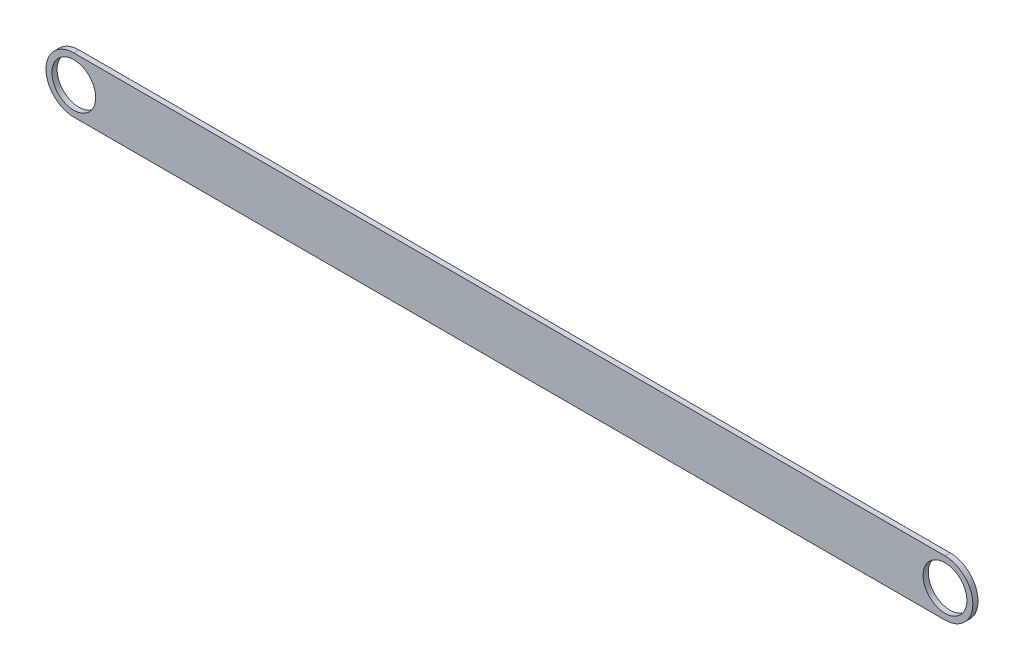
ISO-10303-21;
HEADER;
FILE_DESCRIPTION(('STEP AP214'),'2;1');
FILE_NAME('part.step','',(''),(''),'','','');
FILE_SCHEMA(('AUTOMOTIVE_DESIGN { 1 0 10303 214 1 1 1 1 }'));
ENDSEC;
DATA;
#1=APPLICATION_CONTEXT('core data for automotive mechanical design processes');
#2=APPLICATION_PROTOCOL_DEFINITION('international standard','automotive_design',2000,#1);
#3=PRODUCT_CONTEXT('',#1,'mechanical');
#4=PRODUCT('Part','Part','',(#3));
#5=PRODUCT_RELATED_PRODUCT_CATEGORY('part','',(#4));
#6=PRODUCT_DEFINITION_FORMATION('','',#4);
#7=PRODUCT_DEFINITION_CONTEXT('part definition',#1,'design');
#8=PRODUCT_DEFINITION('design','',#6,#7);
#9=PRODUCT_DEFINITION_SHAPE('','',#8);
#10=(LENGTH_UNIT() NAMED_UNIT(*) SI_UNIT(.MILLI.,.METRE.));
#11=(NAMED_UNIT(*) PLANE_ANGLE_UNIT() SI_UNIT($,.RADIAN.));
#12=(NAMED_UNIT(*) SI_UNIT($,.STERADIAN.) SOLID_ANGLE_UNIT());
#13=UNCERTAINTY_MEASURE_WITH_UNIT(LENGTH_MEASURE(1.E-05),#10,'distance_accuracy_value','');
#14=(GEOMETRIC_REPRESENTATION_CONTEXT(3) GLOBAL_UNCERTAINTY_ASSIGNED_CONTEXT((#13)) GLOBAL_UNIT_ASSIGNED_CONTEXT((#10,
#11,#12)) REPRESENTATION_CONTEXT('',''));
#15=CARTESIAN_POINT('',(0.,0.,0.));
#16=DIRECTION('',(0.,0.,1.));
#17=DIRECTION('',(1.,0.,0.));
#18=AXIS2_PLACEMENT_3D('',#15,#16,#17);
#19=CARTESIAN_POINT('',(21.209,12.2555,0.));
#20=DIRECTION('',(0.,1.,0.));
#21=DIRECTION('',(1.,0.,0.));
#22=AXIS2_PLACEMENT_3D('',#19,#20,#21);
#23=PLANE('',#22);
#24=DIRECTION('',(1.,0.,0.));
#25=VECTOR('',#24,1.);
#26=CARTESIAN_POINT('',(21.209,12.2555,0.03556));
#27=LINE('',#26,#25);
#28=CARTESIAN_POINT('',(21.209,12.2555,0.03556));
#29=VERTEX_POINT('',#28);
#30=CARTESIAN_POINT('',(27.178,12.2555,0.03556));
#31=VERTEX_POINT('',#30);
#32=EDGE_CURVE('E11',#29,#31,#27,.T.);
#33=ORIENTED_EDGE('',*,*,#32,.F.);
#34=DIRECTION('',(0.,0.,1.));
#35=VECTOR('',#34,1.);
#36=CARTESIAN_POINT('',(21.209,12.2555,0.));
#37=LINE('',#36,#35);
#38=CARTESIAN_POINT('',(21.209,12.2555,0.));
#39=VERTEX_POINT('',#38);
#40=EDGE_CURVE('E23',#39,#29,#37,.T.);
#41=ORIENTED_EDGE('',*,*,#40,.F.);
#42=DIRECTION('',(1.,0.,0.));
#43=VECTOR('',#42,1.);
#44=CARTESIAN_POINT('',(21.209,12.2555,0.));
#45=LINE('',#44,#43);
#46=CARTESIAN_POINT('',(27.178,12.2555,0.));
#47=VERTEX_POINT('',#46);
#48=EDGE_CURVE('E108',#39,#47,#45,.T.);
#49=ORIENTED_EDGE('',*,*,#48,.T.);
#50=DIRECTION('',(0.,0.,1.));
#51=VECTOR('',#50,1.);
#52=CARTESIAN_POINT('',(27.178,12.2555,0.));
#53=LINE('',#52,#51);
#54=EDGE_CURVE('E36',#47,#31,#53,.T.);
#55=ORIENTED_EDGE('',*,*,#54,.T.);
#56=EDGE_LOOP('',(#33,#41,#49,#55));
#57=FACE_BOUND('',#56,.T.);
#58=ADVANCED_FACE('F16',(#57),#23,.F.);
#59=CARTESIAN_POINT('',(21.209,12.446,0.));
#60=DIRECTION('',(0.,0.,-1.));
#61=DIRECTION('',(0.,1.,0.));
#62=AXIS2_PLACEMENT_3D('',#59,#60,#61);
#63=CYLINDRICAL_SURFACE('',#62,0.1905);
#64=CARTESIAN_POINT('',(21.209,12.446,0.03556));
#65=DIRECTION('',(0.,0.,1.));
#66=DIRECTION('',(0.,1.,0.));
#67=AXIS2_PLACEMENT_3D('',#64,#65,#66);
#68=CIRCLE('',#67,0.1905);
#69=CARTESIAN_POINT('',(21.209,12.6365,0.03556));
#70=VERTEX_POINT('',#69);
#71=EDGE_CURVE('E104',#70,#29,#68,.T.);
#72=ORIENTED_EDGE('',*,*,#71,.F.);
#73=DIRECTION('',(0.,0.,1.));
#74=VECTOR('',#73,1.);
#75=CARTESIAN_POINT('',(21.209,12.6365,0.));
#76=LINE('',#75,#74);
#77=CARTESIAN_POINT('',(21.209,12.6365,0.));
#78=VERTEX_POINT('',#77);
#79=EDGE_CURVE('E102',#78,#70,#76,.T.);
#80=ORIENTED_EDGE('',*,*,#79,.F.);
#81=CARTESIAN_POINT('',(21.209,12.446,0.));
#82=DIRECTION('',(0.,0.,1.));
#83=DIRECTION('',(0.,1.,0.));
#84=AXIS2_PLACEMENT_3D('',#81,#82,#83);
#85=CIRCLE('',#84,0.1905);
#86=EDGE_CURVE('E100',#78,#39,#85,.T.);
#87=ORIENTED_EDGE('',*,*,#86,.T.);
#88=ORIENTED_EDGE('',*,*,#40,.T.);
#89=EDGE_LOOP('',(#72,#80,#87,#88));
#90=FACE_BOUND('',#89,.T.);
#91=ADVANCED_FACE('F124',(#90),#63,.T.);
#92=CARTESIAN_POINT('',(27.178,12.446,0.));
#93=DIRECTION('',(0.,0.,-1.));
#94=DIRECTION('',(0.,-1.,0.));
#95=AXIS2_PLACEMENT_3D('',#92,#93,#94);
#96=CYLINDRICAL_SURFACE('',#95,0.1905);
#97=CARTESIAN_POINT('',(27.178,12.446,0.03556));
#98=DIRECTION('',(0.,0.,1.));
#99=DIRECTION('',(0.,-1.,0.));
#100=AXIS2_PLACEMENT_3D('',#97,#98,#99);
#101=CIRCLE('',#100,0.1905);
#102=CARTESIAN_POINT('',(27.178,12.6365,0.03556));
#103=VERTEX_POINT('',#102);
#104=EDGE_CURVE('E97',#31,#103,#101,.T.);
#105=ORIENTED_EDGE('',*,*,#104,.F.);
#106=ORIENTED_EDGE('',*,*,#54,.F.);
#107=CARTESIAN_POINT('',(27.178,12.446,0.));
#108=DIRECTION('',(0.,0.,1.));
#109=DIRECTION('',(0.,-1.,0.));
#110=AXIS2_PLACEMENT_3D('',#107,#108,#109);
#111=CIRCLE('',#110,0.1905);
#112=CARTESIAN_POINT('',(27.178,12.6365,0.));
#113=VERTEX_POINT('',#112);
#114=EDGE_CURVE('E94',#47,#113,#111,.T.);
#115=ORIENTED_EDGE('',*,*,#114,.T.);
#116=DIRECTION('',(0.,0.,1.));
#117=VECTOR('',#116,1.);
#118=CARTESIAN_POINT('',(27.178,12.6365,0.));
#119=LINE('',#118,#117);
#120=EDGE_CURVE('E92',#113,#103,#119,.T.);
#121=ORIENTED_EDGE('',*,*,#120,.T.);
#122=EDGE_LOOP('',(#105,#106,#115,#121));
#123=FACE_BOUND('',#122,.T.);
#124=ADVANCED_FACE('F117',(#123),#96,.T.);
#125=CARTESIAN_POINT('',(27.178,12.6365,0.));
#126=DIRECTION('',(0.,-1.,0.));
#127=DIRECTION('',(-1.,0.,0.));
#128=AXIS2_PLACEMENT_3D('',#125,#126,#127);
#129=PLANE('',#128);
#130=DIRECTION('',(-1.,0.,0.));
#131=VECTOR('',#130,1.);
#132=CARTESIAN_POINT('',(27.178,12.6365,0.03556));
#133=LINE('',#132,#131);
#134=EDGE_CURVE('E89',#103,#70,#133,.T.);
#135=ORIENTED_EDGE('',*,*,#134,.F.);
#136=ORIENTED_EDGE('',*,*,#120,.F.);
#137=DIRECTION('',(-1.,0.,0.));
#138=VECTOR('',#137,1.);
#139=CARTESIAN_POINT('',(27.178,12.6365,0.));
#140=LINE('',#139,#138);
#141=EDGE_CURVE('E86',#113,#78,#140,.T.);
#142=ORIENTED_EDGE('',*,*,#141,.T.);
#143=ORIENTED_EDGE('',*,*,#79,.T.);
#144=EDGE_LOOP('',(#135,#136,#142,#143));
#145=FACE_BOUND('',#144,.T.);
#146=ADVANCED_FACE('F123',(#145),#129,.F.);
#147=CARTESIAN_POINT('',(21.209,12.446,0.));
#148=DIRECTION('',(0.,0.,-1.));
#149=DIRECTION('',(1.,0.,0.));
#150=AXIS2_PLACEMENT_3D('',#147,#148,#149);
#151=CYLINDRICAL_SURFACE('',#150,0.1499997);
#152=DIRECTION('',(0.,0.,1.));
#153=VECTOR('',#152,1.);
#154=CARTESIAN_POINT('',(21.3589997,12.446,0.));
#155=LINE('',#154,#153);
#156=CARTESIAN_POINT('',(21.3589997,12.446,0.));
#157=VERTEX_POINT('',#156);
#158=CARTESIAN_POINT('',(21.3589997,12.446,0.03556));
#159=VERTEX_POINT('',#158);
#160=EDGE_CURVE('E83',#157,#159,#155,.T.);
#161=ORIENTED_EDGE('',*,*,#160,.T.);
#162=CARTESIAN_POINT('',(21.209,12.446,0.03556));
#163=DIRECTION('',(0.,0.,1.));
#164=DIRECTION('',(1.,0.,0.));
#165=AXIS2_PLACEMENT_3D('',#162,#163,#164);
#166=CIRCLE('',#165,0.1499997);
#167=EDGE_CURVE('E81',#159,#159,#166,.T.);
#168=ORIENTED_EDGE('',*,*,#167,.T.);
#169=ORIENTED_EDGE('',*,*,#160,.F.);
#170=CARTESIAN_POINT('',(21.209,12.446,0.));
#171=DIRECTION('',(0.,0.,1.));
#172=DIRECTION('',(1.,0.,0.));
#173=AXIS2_PLACEMENT_3D('',#170,#171,#172);
#174=CIRCLE('',#173,0.1499997);
#175=EDGE_CURVE('E73',#157,#157,#174,.T.);
#176=ORIENTED_EDGE('',*,*,#175,.F.);
#177=EDGE_LOOP('',(#161,#168,#169,#176));
#178=FACE_BOUND('',#177,.T.);
#179=ADVANCED_FACE('F135',(#178),#151,.F.);
#180=CARTESIAN_POINT('',(27.178,12.446,0.));
#181=DIRECTION('',(0.,0.,-1.));
#182=DIRECTION('',(1.,0.,0.));
#183=AXIS2_PLACEMENT_3D('',#180,#181,#182);
#184=CYLINDRICAL_SURFACE('',#183,0.1499997);
#185=DIRECTION('',(0.,0.,1.));
#186=VECTOR('',#185,1.);
#187=CARTESIAN_POINT('',(27.3279997,12.446,0.));
#188=LINE('',#187,#186);
#189=CARTESIAN_POINT('',(27.3279997,12.446,0.));
#190=VERTEX_POINT('',#189);
#191=CARTESIAN_POINT('',(27.3279997,12.446,0.03556));
#192=VERTEX_POINT('',#191);
#193=EDGE_CURVE('E67',#190,#192,#188,.T.);
#194=ORIENTED_EDGE('',*,*,#193,.T.);
#195=CARTESIAN_POINT('',(27.178,12.446,0.03556));
#196=DIRECTION('',(0.,0.,1.));
#197=DIRECTION('',(1.,0.,0.));
#198=AXIS2_PLACEMENT_3D('',#195,#196,#197);
#199=CIRCLE('',#198,0.1499997);
#200=EDGE_CURVE('E72',#192,#192,#199,.T.);
#201=ORIENTED_EDGE('',*,*,#200,.T.);
#202=ORIENTED_EDGE('',*,*,#193,.F.);
#203=CARTESIAN_POINT('',(27.178,12.446,0.));
#204=DIRECTION('',(0.,0.,1.));
#205=DIRECTION('',(1.,0.,0.));
#206=AXIS2_PLACEMENT_3D('',#203,#204,#205);
#207=CIRCLE('',#206,0.1499997);
#208=EDGE_CURVE('E70',#190,#190,#207,.T.);
#209=ORIENTED_EDGE('',*,*,#208,.F.);
#210=EDGE_LOOP('',(#194,#201,#202,#209));
#211=FACE_BOUND('',#210,.T.);
#212=ADVANCED_FACE('F69',(#211),#184,.F.);
#213=CARTESIAN_POINT('',(24.1935,12.446,0.));
#214=DIRECTION('',(0.,0.,1.));
#215=DIRECTION('',(1.,0.,0.));
#216=AXIS2_PLACEMENT_3D('',#213,#214,#215);
#217=PLANE('',#216);
#218=ORIENTED_EDGE('',*,*,#141,.F.);
#219=ORIENTED_EDGE('',*,*,#114,.F.);
#220=ORIENTED_EDGE('',*,*,#48,.F.);
#221=ORIENTED_EDGE('',*,*,#86,.F.);
#222=EDGE_LOOP('',(#218,#219,#220,#221));
#223=FACE_BOUND('',#222,.T.);
#224=ORIENTED_EDGE('',*,*,#175,.T.);
#225=EDGE_LOOP('',(#224));
#226=FACE_BOUND('',#225,.T.);
#227=ORIENTED_EDGE('',*,*,#208,.T.);
#228=EDGE_LOOP('',(#227));
#229=FACE_BOUND('',#228,.T.);
#230=ADVANCED_FACE('F76',(#223,#226,#229),#217,.F.);
#231=CARTESIAN_POINT('',(24.1935,12.446,0.03556));
#232=DIRECTION('',(0.,0.,1.));
#233=DIRECTION('',(1.,0.,0.));
#234=AXIS2_PLACEMENT_3D('',#231,#232,#233);
#235=PLANE('',#234);
#236=ORIENTED_EDGE('',*,*,#32,.T.);
#237=ORIENTED_EDGE('',*,*,#104,.T.);
#238=ORIENTED_EDGE('',*,*,#134,.T.);
#239=ORIENTED_EDGE('',*,*,#71,.T.);
#240=EDGE_LOOP('',(#236,#237,#238,#239));
#241=FACE_BOUND('',#240,.T.);
#242=ORIENTED_EDGE('',*,*,#167,.F.);
#243=EDGE_LOOP('',(#242));
#244=FACE_BOUND('',#243,.T.);
#245=ORIENTED_EDGE('',*,*,#200,.F.);
#246=EDGE_LOOP('',(#245));
#247=FACE_BOUND('',#246,.T.);
#248=ADVANCED_FACE('F120',(#241,#244,#247),#235,.T.);
#249=CLOSED_SHELL('',(#58,#91,#124,#146,#179,#212,#230,#248));
#250=MANIFOLD_SOLID_BREP('B1',#249);
#251=ADVANCED_BREP_SHAPE_REPRESENTATION('',(#18,#250),#14);
#252=SHAPE_DEFINITION_REPRESENTATION(#9,#251);
ENDSEC;
END-ISO-10303-21;
